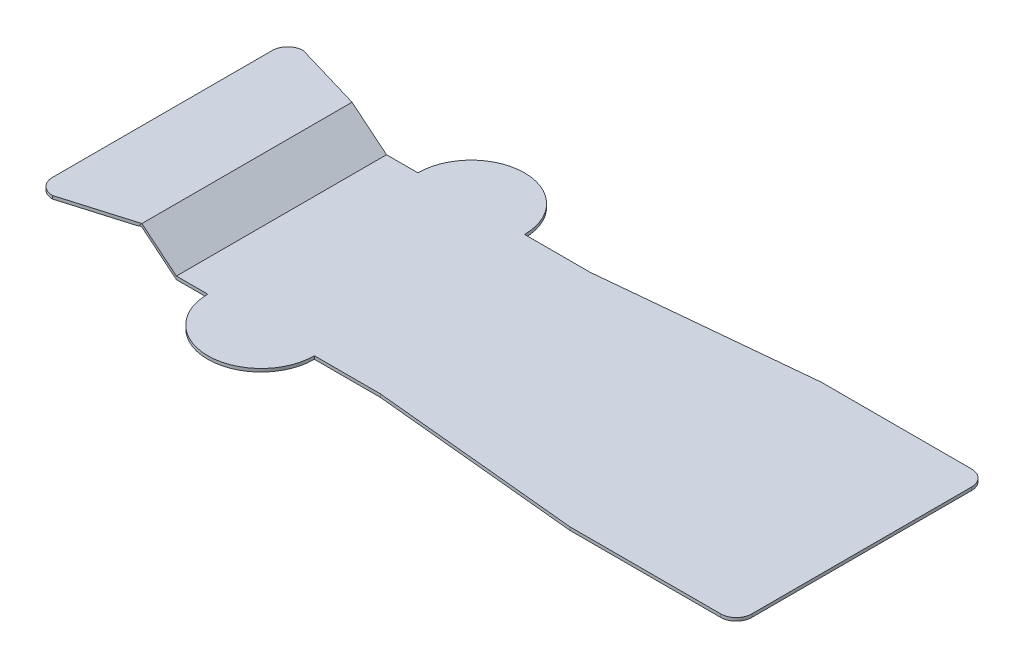
ISO-10303-21;
HEADER;
FILE_DESCRIPTION(('STEP AP214'),'2;1');
FILE_NAME('part.step','',(''),(''),'','','');
FILE_SCHEMA(('AUTOMOTIVE_DESIGN { 1 0 10303 214 1 1 1 1 }'));
ENDSEC;
DATA;
#1=APPLICATION_CONTEXT('core data for automotive mechanical design processes');
#2=APPLICATION_PROTOCOL_DEFINITION('international standard','automotive_design',2000,#1);
#3=PRODUCT_CONTEXT('',#1,'mechanical');
#4=PRODUCT('Part','Part','',(#3));
#5=PRODUCT_RELATED_PRODUCT_CATEGORY('part','',(#4));
#6=PRODUCT_DEFINITION_FORMATION('','',#4);
#7=PRODUCT_DEFINITION_CONTEXT('part definition',#1,'design');
#8=PRODUCT_DEFINITION('design','',#6,#7);
#9=PRODUCT_DEFINITION_SHAPE('','',#8);
#10=(LENGTH_UNIT() NAMED_UNIT(*) SI_UNIT(.MILLI.,.METRE.));
#11=(NAMED_UNIT(*) PLANE_ANGLE_UNIT() SI_UNIT($,.RADIAN.));
#12=(NAMED_UNIT(*) SI_UNIT($,.STERADIAN.) SOLID_ANGLE_UNIT());
#13=UNCERTAINTY_MEASURE_WITH_UNIT(LENGTH_MEASURE(1.E-05),#10,'distance_accuracy_value','');
#14=(GEOMETRIC_REPRESENTATION_CONTEXT(3) GLOBAL_UNCERTAINTY_ASSIGNED_CONTEXT((#13)) GLOBAL_UNIT_ASSIGNED_CONTEXT((#10,
#11,#12)) REPRESENTATION_CONTEXT('',''));
#15=CARTESIAN_POINT('',(0.,0.,0.));
#16=DIRECTION('',(0.,0.,1.));
#17=DIRECTION('',(1.,0.,0.));
#18=AXIS2_PLACEMENT_3D('',#15,#16,#17);
#19=CARTESIAN_POINT('',(-100.227722772277,-9.22277227722782,33.5));
#20=DIRECTION('',(0.,0.,-1.));
#21=DIRECTION('',(-1.,0.,0.));
#22=AXIS2_PLACEMENT_3D('',#19,#20,#21);
#23=PLANE('',#22);
#24=DIRECTION('',(-1.,0.,0.));
#25=VECTOR('',#24,1.);
#26=CARTESIAN_POINT('',(-73.5000000000001,0.,33.4999999999999));
#27=LINE('',#26,#25);
#28=CARTESIAN_POINT('',(-63.5000000000001,0.,33.4999999999999));
#29=VERTEX_POINT('',#28);
#30=CARTESIAN_POINT('',(-73.5000000000001,0.,33.4999999999999));
#31=VERTEX_POINT('',#30);
#32=EDGE_CURVE('E66',#29,#31,#27,.T.);
#33=ORIENTED_EDGE('',*,*,#32,.F.);
#34=DIRECTION('',(0.,1.,0.));
#35=VECTOR('',#34,1.);
#36=CARTESIAN_POINT('',(-63.5000000000001,0.,33.4999999999999));
#37=LINE('',#36,#35);
#38=CARTESIAN_POINT('',(-63.5000000000001,0.999999999999979,33.4999999999999));
#39=VERTEX_POINT('',#38);
#40=EDGE_CURVE('E204',#29,#39,#37,.T.);
#41=ORIENTED_EDGE('',*,*,#40,.T.);
#42=DIRECTION('',(-1.,0.,0.));
#43=VECTOR('',#42,1.);
#44=CARTESIAN_POINT('',(-73.5000000000001,0.999999999999977,33.4999999999999));
#45=LINE('',#44,#43);
#46=CARTESIAN_POINT('',(-73.5000000000001,0.999999999999723,33.4999999999999));
#47=VERTEX_POINT('',#46);
#48=EDGE_CURVE('E194',#39,#47,#45,.T.);
#49=ORIENTED_EDGE('',*,*,#48,.T.);
#50=DIRECTION('',(-0.77395729920332,0.633237790257263,0.));
#51=VECTOR('',#50,1.);
#52=CARTESIAN_POINT('',(-84.5,9.99999999999992,33.5));
#53=LINE('',#52,#51);
#54=CARTESIAN_POINT('',(-84.5,10.,33.5));
#55=VERTEX_POINT('',#54);
#56=EDGE_CURVE('E284',#47,#55,#53,.T.);
#57=ORIENTED_EDGE('',*,*,#56,.T.);
#58=DIRECTION('',(0.633237790257263,0.773957299203321,0.));
#59=VECTOR('',#58,1.);
#60=CARTESIAN_POINT('',(-100.227722772277,-9.22277227722782,33.5));
#61=LINE('',#60,#59);
#62=CARTESIAN_POINT('',(-85.3181818181817,9.,33.5));
#63=VERTEX_POINT('',#62);
#64=EDGE_CURVE('E276',#63,#55,#61,.T.);
#65=ORIENTED_EDGE('',*,*,#64,.F.);
#66=DIRECTION('',(1.,0.,0.));
#67=VECTOR('',#66,1.);
#68=CARTESIAN_POINT('',(-111.5,9.,33.5000000000001));
#69=LINE('',#68,#67);
#70=CARTESIAN_POINT('',(-84.5,9.,33.5));
#71=VERTEX_POINT('',#70);
#72=EDGE_CURVE('E292',#63,#71,#69,.T.);
#73=ORIENTED_EDGE('',*,*,#72,.T.);
#74=DIRECTION('',(0.77395729920332,-0.633237790257263,0.));
#75=VECTOR('',#74,1.);
#76=CARTESIAN_POINT('',(-84.4999999999998,8.99999999999982,33.5));
#77=LINE('',#76,#75);
#78=EDGE_CURVE('E287',#71,#31,#77,.T.);
#79=ORIENTED_EDGE('',*,*,#78,.T.);
#80=EDGE_LOOP('',(#33,#41,#49,#57,#65,#73,#79));
#81=FACE_BOUND('',#80,.T.);
#82=ADVANCED_FACE('F43',(#81),#23,.F.);
#83=CARTESIAN_POINT('',(-100.227722772277,-9.22277227722775,-33.5));
#84=DIRECTION('',(0.,0.,1.));
#85=DIRECTION('',(1.,0.,0.));
#86=AXIS2_PLACEMENT_3D('',#83,#84,#85);
#87=PLANE('',#86);
#88=DIRECTION('',(0.,1.,0.));
#89=VECTOR('',#88,1.);
#90=CARTESIAN_POINT('',(-29.5000000000001,0.,-33.5));
#91=LINE('',#90,#89);
#92=CARTESIAN_POINT('',(-29.5000000000001,0.,-33.5));
#93=VERTEX_POINT('',#92);
#94=CARTESIAN_POINT('',(-29.5000000000001,0.999999999999983,-33.5));
#95=VERTEX_POINT('',#94);
#96=EDGE_CURVE('E223',#93,#95,#91,.T.);
#97=ORIENTED_EDGE('',*,*,#96,.T.);
#98=DIRECTION('',(1.,0.,0.));
#99=VECTOR('',#98,1.);
#100=CARTESIAN_POINT('',(-73.5000000000001,0.999999999999977,-33.5));
#101=LINE('',#100,#99);
#102=CARTESIAN_POINT('',(-8.49999999999995,0.999999999999985,-33.4999999999999));
#103=VERTEX_POINT('',#102);
#104=EDGE_CURVE('E273',#95,#103,#101,.T.);
#105=ORIENTED_EDGE('',*,*,#104,.T.);
#106=DIRECTION('',(0.,1.,0.));
#107=VECTOR('',#106,1.);
#108=CARTESIAN_POINT('',(-8.49999999999995,0.,-33.4999999999999));
#109=LINE('',#108,#107);
#110=CARTESIAN_POINT('',(-8.49999999999995,0.,-33.4999999999999));
#111=VERTEX_POINT('',#110);
#112=EDGE_CURVE('E269',#111,#103,#109,.T.);
#113=ORIENTED_EDGE('',*,*,#112,.F.);
#114=DIRECTION('',(1.,0.,0.));
#115=VECTOR('',#114,1.);
#116=CARTESIAN_POINT('',(-73.5000000000001,0.,-33.5));
#117=LINE('',#116,#115);
#118=EDGE_CURVE('E270',#93,#111,#117,.T.);
#119=ORIENTED_EDGE('',*,*,#118,.F.);
#120=EDGE_LOOP('',(#97,#105,#113,#119));
#121=FACE_BOUND('',#120,.T.);
#122=ADVANCED_FACE('F418',(#121),#87,.F.);
#123=DIRECTION('',(0.,1.,0.));
#124=VECTOR('',#123,1.);
#125=CARTESIAN_POINT('',(-63.5000000000001,0.,-33.5));
#126=LINE('',#125,#124);
#127=CARTESIAN_POINT('',(-63.5000000000001,0.,-33.5));
#128=VERTEX_POINT('',#127);
#129=CARTESIAN_POINT('',(-63.5000000000001,0.999999999999979,-33.5));
#130=VERTEX_POINT('',#129);
#131=EDGE_CURVE('E220',#128,#130,#126,.T.);
#132=ORIENTED_EDGE('',*,*,#131,.F.);
#133=CARTESIAN_POINT('',(-73.5000000000002,0.,-33.5));
#134=VERTEX_POINT('',#133);
#135=EDGE_CURVE('E266',#134,#128,#117,.T.);
#136=ORIENTED_EDGE('',*,*,#135,.F.);
#137=DIRECTION('',(-0.77395729920332,0.633237790257263,0.));
#138=VECTOR('',#137,1.);
#139=CARTESIAN_POINT('',(-84.5,9.,-33.5));
#140=LINE('',#139,#138);
#141=CARTESIAN_POINT('',(-84.5,9.,-33.5));
#142=VERTEX_POINT('',#141);
#143=EDGE_CURVE('E298',#134,#142,#140,.T.);
#144=ORIENTED_EDGE('',*,*,#143,.T.);
#145=DIRECTION('',(-1.,0.,0.));
#146=VECTOR('',#145,1.);
#147=CARTESIAN_POINT('',(-111.5,9.,-33.5));
#148=LINE('',#147,#146);
#149=CARTESIAN_POINT('',(-85.3181818181819,9.,-33.5));
#150=VERTEX_POINT('',#149);
#151=EDGE_CURVE('E300',#142,#150,#148,.T.);
#152=ORIENTED_EDGE('',*,*,#151,.T.);
#153=DIRECTION('',(0.633237790257263,0.773957299203321,0.));
#154=VECTOR('',#153,1.);
#155=CARTESIAN_POINT('',(-100.227722772277,-9.22277227722775,-33.5));
#156=LINE('',#155,#154);
#157=CARTESIAN_POINT('',(-84.5000000000001,9.99999999999999,-33.5));
#158=VERTEX_POINT('',#157);
#159=EDGE_CURVE('E283',#150,#158,#156,.T.);
#160=ORIENTED_EDGE('',*,*,#159,.T.);
#161=DIRECTION('',(0.773957299203321,-0.633237790257263,0.));
#162=VECTOR('',#161,1.);
#163=CARTESIAN_POINT('',(-84.5000000000001,9.99999999999999,-33.5));
#164=LINE('',#163,#162);
#165=CARTESIAN_POINT('',(-73.5000000000001,0.999999999999977,-33.5));
#166=VERTEX_POINT('',#165);
#167=EDGE_CURVE('E280',#158,#166,#164,.T.);
#168=ORIENTED_EDGE('',*,*,#167,.T.);
#169=EDGE_CURVE('E271',#166,#130,#101,.T.);
#170=ORIENTED_EDGE('',*,*,#169,.T.);
#171=EDGE_LOOP('',(#132,#136,#144,#152,#160,#168,#170));
#172=FACE_BOUND('',#171,.T.);
#173=ADVANCED_FACE('F396',(#172),#87,.F.);
#174=CARTESIAN_POINT('',(-111.5,10.,40.));
#175=DIRECTION('',(0.,0.,-1.));
#176=DIRECTION('',(-1.,0.,0.));
#177=AXIS2_PLACEMENT_3D('',#174,#175,#176);
#178=PLANE('',#177);
#179=DIRECTION('',(0.,1.,0.));
#180=VECTOR('',#179,1.);
#181=CARTESIAN_POINT('',(106.53,0.,40.));
#182=LINE('',#181,#180);
#183=CARTESIAN_POINT('',(106.53,0.,40.));
#184=VERTEX_POINT('',#183);
#185=CARTESIAN_POINT('',(106.53,0.999999999999999,40.));
#186=VERTEX_POINT('',#185);
#187=EDGE_CURVE('E235',#184,#186,#182,.T.);
#188=ORIENTED_EDGE('',*,*,#187,.T.);
#189=DIRECTION('',(-1.,0.,0.));
#190=VECTOR('',#189,1.);
#191=CARTESIAN_POINT('',(-73.5,0.999999999999977,40.));
#192=LINE('',#191,#190);
#193=CARTESIAN_POINT('',(58.5,0.999999999999994,40.));
#194=VERTEX_POINT('',#193);
#195=EDGE_CURVE('E325',#186,#194,#192,.T.);
#196=ORIENTED_EDGE('',*,*,#195,.T.);
#197=DIRECTION('',(0.,1.,0.));
#198=VECTOR('',#197,1.);
#199=CARTESIAN_POINT('',(58.5,0.,40.));
#200=LINE('',#199,#198);
#201=CARTESIAN_POINT('',(58.5,0.,40.));
#202=VERTEX_POINT('',#201);
#203=EDGE_CURVE('E251',#202,#194,#200,.T.);
#204=ORIENTED_EDGE('',*,*,#203,.F.);
#205=DIRECTION('',(1.,0.,0.));
#206=VECTOR('',#205,1.);
#207=CARTESIAN_POINT('',(-111.5,0.,40.));
#208=LINE('',#207,#206);
#209=EDGE_CURVE('E356',#202,#184,#208,.T.);
#210=ORIENTED_EDGE('',*,*,#209,.T.);
#211=EDGE_LOOP('',(#188,#196,#204,#210));
#212=FACE_BOUND('',#211,.T.);
#213=ADVANCED_FACE('F486',(#212),#178,.F.);
#214=CARTESIAN_POINT('',(0.,0.,0.));
#215=DIRECTION('',(0.,1.,0.));
#216=DIRECTION('',(0.,0.,1.));
#217=AXIS2_PLACEMENT_3D('',#214,#215,#216);
#218=PLANE('',#217);
#219=CARTESIAN_POINT('',(106.53,0.,-35.03));
#220=DIRECTION('',(0.,1.,0.));
#221=DIRECTION('',(-1.,0.,0.));
#222=AXIS2_PLACEMENT_3D('',#219,#220,#221);
#223=CIRCLE('',#222,4.97);
#224=CARTESIAN_POINT('',(111.5,0.,-35.03));
#225=VERTEX_POINT('',#224);
#226=CARTESIAN_POINT('',(106.53,0.,-40.));
#227=VERTEX_POINT('',#226);
#228=EDGE_CURVE('E229',#225,#227,#223,.T.);
#229=ORIENTED_EDGE('',*,*,#228,.F.);
#230=DIRECTION('',(0.,0.,-1.));
#231=VECTOR('',#230,1.);
#232=CARTESIAN_POINT('',(111.5,0.,-40.));
#233=LINE('',#232,#231);
#234=CARTESIAN_POINT('',(111.5,0.,35.03));
#235=VERTEX_POINT('',#234);
#236=EDGE_CURVE('E340',#235,#225,#233,.T.);
#237=ORIENTED_EDGE('',*,*,#236,.F.);
#238=CARTESIAN_POINT('',(106.53,0.,35.03));
#239=DIRECTION('',(0.,1.,0.));
#240=DIRECTION('',(-1.,0.,0.));
#241=AXIS2_PLACEMENT_3D('',#238,#239,#240);
#242=CIRCLE('',#241,4.97);
#243=EDGE_CURVE('E241',#235,#184,#242,.F.);
#244=ORIENTED_EDGE('',*,*,#243,.T.);
#245=ORIENTED_EDGE('',*,*,#209,.F.);
#246=DIRECTION('',(0.995327012628998,0.,0.0965615758520676));
#247=VECTOR('',#246,1.);
#248=CARTESIAN_POINT('',(-3.29895172413795,0.,34.0045793103448));
#249=LINE('',#248,#247);
#250=CARTESIAN_POINT('',(-8.49999999999995,0.,33.4999999999999));
#251=VERTEX_POINT('',#250);
#252=EDGE_CURVE('E249',#251,#202,#249,.T.);
#253=ORIENTED_EDGE('',*,*,#252,.F.);
#254=CARTESIAN_POINT('',(-29.5000000000001,0.,33.4999999999999));
#255=VERTEX_POINT('',#254);
#256=EDGE_CURVE('E202',#251,#255,#27,.T.);
#257=ORIENTED_EDGE('',*,*,#256,.T.);
#258=CARTESIAN_POINT('',(-46.5000000000001,0.,33.5));
#259=DIRECTION('',(0.,1.,0.));
#260=DIRECTION('',(-1.,0.,0.));
#261=AXIS2_PLACEMENT_3D('',#258,#259,#260);
#262=CIRCLE('',#261,17.);
#263=EDGE_CURVE('E209',#29,#255,#262,.T.);
#264=ORIENTED_EDGE('',*,*,#263,.F.);
#265=ORIENTED_EDGE('',*,*,#32,.T.);
#266=DIRECTION('',(0.,0.,1.));
#267=VECTOR('',#266,1.);
#268=CARTESIAN_POINT('',(-73.5,0.,-40.));
#269=LINE('',#268,#267);
#270=EDGE_CURVE('E345',#134,#31,#269,.T.);
#271=ORIENTED_EDGE('',*,*,#270,.F.);
#272=ORIENTED_EDGE('',*,*,#135,.T.);
#273=CARTESIAN_POINT('',(-46.5000000000001,0.,-33.5));
#274=DIRECTION('',(0.,1.,0.));
#275=DIRECTION('',(-1.,0.,0.));
#276=AXIS2_PLACEMENT_3D('',#273,#274,#275);
#277=CIRCLE('',#276,17.);
#278=EDGE_CURVE('E217',#128,#93,#277,.F.);
#279=ORIENTED_EDGE('',*,*,#278,.T.);
#280=ORIENTED_EDGE('',*,*,#118,.T.);
#281=DIRECTION('',(0.995327012628998,0.,-0.0965615758520672));
#282=VECTOR('',#281,1.);
#283=CARTESIAN_POINT('',(-3.29895172413794,0.,-34.0045793103448));
#284=LINE('',#283,#282);
#285=CARTESIAN_POINT('',(58.5,0.,-40.));
#286=VERTEX_POINT('',#285);
#287=EDGE_CURVE('E259',#111,#286,#284,.T.);
#288=ORIENTED_EDGE('',*,*,#287,.T.);
#289=DIRECTION('',(-1.,0.,0.));
#290=VECTOR('',#289,1.);
#291=CARTESIAN_POINT('',(-111.5,0.,-40.));
#292=LINE('',#291,#290);
#293=EDGE_CURVE('E359',#227,#286,#292,.T.);
#294=ORIENTED_EDGE('',*,*,#293,.F.);
#295=EDGE_LOOP('',(#229,#237,#244,#245,#253,#257,#264,#265,#271,#272,#279,#280,#288,#294));
#296=FACE_BOUND('',#295,.T.);
#297=ADVANCED_FACE('F490',(#296),#218,.F.);
#298=CARTESIAN_POINT('',(-73.5,0.999999999999977,-40.));
#299=DIRECTION('',(0.,1.,0.));
#300=DIRECTION('',(-1.,0.,0.));
#301=AXIS2_PLACEMENT_3D('',#298,#299,#300);
#302=PLANE('',#301);
#303=DIRECTION('',(0.,0.,1.));
#304=VECTOR('',#303,1.);
#305=CARTESIAN_POINT('',(111.5,1.,-40.));
#306=LINE('',#305,#304);
#307=CARTESIAN_POINT('',(111.5,1.,-35.03));
#308=VERTEX_POINT('',#307);
#309=CARTESIAN_POINT('',(111.5,1.,35.03));
#310=VERTEX_POINT('',#309);
#311=EDGE_CURVE('E342',#308,#310,#306,.T.);
#312=ORIENTED_EDGE('',*,*,#311,.F.);
#313=CARTESIAN_POINT('',(106.53,0.999999999999999,-35.03));
#314=DIRECTION('',(0.,1.,0.));
#315=DIRECTION('',(-1.,0.,0.));
#316=AXIS2_PLACEMENT_3D('',#313,#314,#315);
#317=CIRCLE('',#316,4.97);
#318=CARTESIAN_POINT('',(106.53,0.999999999999999,-40.));
#319=VERTEX_POINT('',#318);
#320=EDGE_CURVE('E232',#308,#319,#317,.T.);
#321=ORIENTED_EDGE('',*,*,#320,.T.);
#322=DIRECTION('',(-1.,0.,0.));
#323=VECTOR('',#322,1.);
#324=CARTESIAN_POINT('',(-73.5,0.999999999999977,-40.));
#325=LINE('',#324,#323);
#326=CARTESIAN_POINT('',(58.5,0.999999999999994,-40.));
#327=VERTEX_POINT('',#326);
#328=EDGE_CURVE('E333',#319,#327,#325,.T.);
#329=ORIENTED_EDGE('',*,*,#328,.T.);
#330=DIRECTION('',(0.995327012628998,0.,-0.0965615758520672));
#331=VECTOR('',#330,1.);
#332=CARTESIAN_POINT('',(-3.29895172413794,0.999999999999986,-34.0045793103448));
#333=LINE('',#332,#331);
#334=EDGE_CURVE('E238',#103,#327,#333,.T.);
#335=ORIENTED_EDGE('',*,*,#334,.F.);
#336=ORIENTED_EDGE('',*,*,#104,.F.);
#337=CARTESIAN_POINT('',(-46.5000000000001,0.999999999999981,-33.5));
#338=DIRECTION('',(0.,1.,0.));
#339=DIRECTION('',(-1.,0.,0.));
#340=AXIS2_PLACEMENT_3D('',#337,#338,#339);
#341=CIRCLE('',#340,17.);
#342=EDGE_CURVE('E215',#130,#95,#341,.F.);
#343=ORIENTED_EDGE('',*,*,#342,.F.);
#344=ORIENTED_EDGE('',*,*,#169,.F.);
#345=DIRECTION('',(0.,0.,1.));
#346=VECTOR('',#345,1.);
#347=CARTESIAN_POINT('',(-73.5,0.999999999999977,-40.));
#348=LINE('',#347,#346);
#349=EDGE_CURVE('E200',#166,#47,#348,.T.);
#350=ORIENTED_EDGE('',*,*,#349,.T.);
#351=ORIENTED_EDGE('',*,*,#48,.F.);
#352=CARTESIAN_POINT('',(-46.5000000000001,0.999999999999981,33.5));
#353=DIRECTION('',(0.,1.,0.));
#354=DIRECTION('',(-1.,0.,0.));
#355=AXIS2_PLACEMENT_3D('',#352,#353,#354);
#356=CIRCLE('',#355,17.);
#357=CARTESIAN_POINT('',(-29.5000000000001,0.999999999999983,33.4999999999999));
#358=VERTEX_POINT('',#357);
#359=EDGE_CURVE('E198',#39,#358,#356,.T.);
#360=ORIENTED_EDGE('',*,*,#359,.T.);
#361=CARTESIAN_POINT('',(-8.49999999999995,0.999999999999985,33.4999999999999));
#362=VERTEX_POINT('',#361);
#363=EDGE_CURVE('E58',#362,#358,#45,.T.);
#364=ORIENTED_EDGE('',*,*,#363,.F.);
#365=DIRECTION('',(0.995327012628998,0.,0.0965615758520676));
#366=VECTOR('',#365,1.);
#367=CARTESIAN_POINT('',(-3.29895172413795,0.999999999999986,34.0045793103448));
#368=LINE('',#367,#366);
#369=EDGE_CURVE('E252',#362,#194,#368,.T.);
#370=ORIENTED_EDGE('',*,*,#369,.T.);
#371=ORIENTED_EDGE('',*,*,#195,.F.);
#372=CARTESIAN_POINT('',(106.53,0.999999999999999,35.03));
#373=DIRECTION('',(0.,1.,0.));
#374=DIRECTION('',(-1.,0.,0.));
#375=AXIS2_PLACEMENT_3D('',#372,#373,#374);
#376=CIRCLE('',#375,4.97);
#377=EDGE_CURVE('E226',#310,#186,#376,.F.);
#378=ORIENTED_EDGE('',*,*,#377,.F.);
#379=EDGE_LOOP('',(#312,#321,#329,#335,#336,#343,#344,#350,#351,#360,#364,#370,#371,#378));
#380=FACE_BOUND('',#379,.T.);
#381=ADVANCED_FACE('F196',(#380),#302,.T.);
#382=CARTESIAN_POINT('',(-111.5,10.,-40.));
#383=DIRECTION('',(0.,0.,1.));
#384=DIRECTION('',(1.,0.,0.));
#385=AXIS2_PLACEMENT_3D('',#382,#383,#384);
#386=PLANE('',#385);
#387=DIRECTION('',(0.,1.,0.));
#388=VECTOR('',#387,1.);
#389=CARTESIAN_POINT('',(106.53,0.,-40.));
#390=LINE('',#389,#388);
#391=EDGE_CURVE('E236',#227,#319,#390,.T.);
#392=ORIENTED_EDGE('',*,*,#391,.F.);
#393=ORIENTED_EDGE('',*,*,#293,.T.);
#394=DIRECTION('',(0.,1.,0.));
#395=VECTOR('',#394,1.);
#396=CARTESIAN_POINT('',(58.5,0.,-40.));
#397=LINE('',#396,#395);
#398=EDGE_CURVE('E255',#286,#327,#397,.T.);
#399=ORIENTED_EDGE('',*,*,#398,.T.);
#400=ORIENTED_EDGE('',*,*,#328,.F.);
#401=EDGE_LOOP('',(#392,#393,#399,#400));
#402=FACE_BOUND('',#401,.T.);
#403=ADVANCED_FACE('F497',(#402),#386,.F.);
#404=CARTESIAN_POINT('',(0.,10.,0.));
#405=DIRECTION('',(0.,1.,0.));
#406=DIRECTION('',(0.,0.,1.));
#407=AXIS2_PLACEMENT_3D('',#404,#405,#406);
#408=PLANE('',#407);
#409=DIRECTION('',(0.,0.,1.));
#410=VECTOR('',#409,1.);
#411=CARTESIAN_POINT('',(-84.5,10.,-40.));
#412=LINE('',#411,#410);
#413=EDGE_CURVE('E337',#158,#55,#412,.T.);
#414=ORIENTED_EDGE('',*,*,#413,.F.);
#415=DIRECTION('',(-0.959120090127778,0.,-0.282999386418564));
#416=VECTOR('',#415,1.);
#417=CARTESIAN_POINT('',(2.32542714549147,10.,-7.88116158693922));
#418=LINE('',#417,#416);
#419=CARTESIAN_POINT('',(-106.529307783056,10.,-40.));
#420=VERTEX_POINT('',#419);
#421=EDGE_CURVE('E307',#158,#420,#418,.T.);
#422=ORIENTED_EDGE('',*,*,#421,.T.);
#423=CARTESIAN_POINT('',(-106.529307783056,10.,-35.0293077830562));
#424=DIRECTION('',(0.,1.,0.));
#425=DIRECTION('',(0.,0.,1.));
#426=AXIS2_PLACEMENT_3D('',#423,#424,#425);
#427=CIRCLE('',#426,4.97069221694385);
#428=CARTESIAN_POINT('',(-111.5,10.,-35.0293077830562));
#429=VERTEX_POINT('',#428);
#430=EDGE_CURVE('E318',#420,#429,#427,.T.);
#431=ORIENTED_EDGE('',*,*,#430,.T.);
#432=DIRECTION('',(0.,0.,1.));
#433=VECTOR('',#432,1.);
#434=CARTESIAN_POINT('',(-111.5,10.,-40.));
#435=LINE('',#434,#433);
#436=CARTESIAN_POINT('',(-111.5,10.,35.0293077830561));
#437=VERTEX_POINT('',#436);
#438=EDGE_CURVE('E353',#429,#437,#435,.T.);
#439=ORIENTED_EDGE('',*,*,#438,.T.);
#440=CARTESIAN_POINT('',(-106.529307783056,10.,35.0293077830562));
#441=DIRECTION('',(0.,1.,0.));
#442=DIRECTION('',(0.,0.,1.));
#443=AXIS2_PLACEMENT_3D('',#440,#441,#442);
#444=CIRCLE('',#443,4.97069221694385);
#445=CARTESIAN_POINT('',(-106.529307783056,10.,40.));
#446=VERTEX_POINT('',#445);
#447=EDGE_CURVE('E317',#446,#437,#444,.F.);
#448=ORIENTED_EDGE('',*,*,#447,.F.);
#449=DIRECTION('',(0.959120090127778,0.,-0.282999386418562));
#450=VECTOR('',#449,1.);
#451=CARTESIAN_POINT('',(2.32542714549151,10.,7.88116158693943));
#452=LINE('',#451,#450);
#453=EDGE_CURVE('E306',#446,#55,#452,.T.);
#454=ORIENTED_EDGE('',*,*,#453,.T.);
#455=EDGE_LOOP('',(#414,#422,#431,#439,#448,#454));
#456=FACE_BOUND('',#455,.T.);
#457=ADVANCED_FACE('F384',(#456),#408,.T.);
#458=CARTESIAN_POINT('',(-111.5,9.,-40.));
#459=DIRECTION('',(0.,-1.,0.));
#460=DIRECTION('',(0.,0.,-1.));
#461=AXIS2_PLACEMENT_3D('',#458,#459,#460);
#462=PLANE('',#461);
#463=DIRECTION('',(0.,0.,-1.));
#464=VECTOR('',#463,1.);
#465=CARTESIAN_POINT('',(-85.3181818181819,9.,-40.));
#466=LINE('',#465,#464);
#467=CARTESIAN_POINT('',(-85.3181818181819,9.,-33.7414139323194));
#468=VERTEX_POINT('',#467);
#469=EDGE_CURVE('E304',#150,#468,#466,.T.);
#470=ORIENTED_EDGE('',*,*,#469,.F.);
#471=ORIENTED_EDGE('',*,*,#151,.F.);
#472=DIRECTION('',(0.,0.,1.));
#473=VECTOR('',#472,1.);
#474=CARTESIAN_POINT('',(-84.5,9.,-40.));
#475=LINE('',#474,#473);
#476=EDGE_CURVE('E348',#142,#71,#475,.T.);
#477=ORIENTED_EDGE('',*,*,#476,.T.);
#478=ORIENTED_EDGE('',*,*,#72,.F.);
#479=DIRECTION('',(0.,0.,-1.));
#480=VECTOR('',#479,1.);
#481=CARTESIAN_POINT('',(-85.3181818181822,9.,-40.0000000000002));
#482=LINE('',#481,#480);
#483=CARTESIAN_POINT('',(-85.3181818181817,9.,33.7414139323194));
#484=VERTEX_POINT('',#483);
#485=EDGE_CURVE('E296',#484,#63,#482,.T.);
#486=ORIENTED_EDGE('',*,*,#485,.F.);
#487=DIRECTION('',(-0.959120090127778,0.,0.282999386418562));
#488=VECTOR('',#487,1.);
#489=CARTESIAN_POINT('',(-89.3874721966624,9.,34.9421047447864));
#490=LINE('',#489,#488);
#491=CARTESIAN_POINT('',(-106.529307783056,9.,40.));
#492=VERTEX_POINT('',#491);
#493=EDGE_CURVE('E315',#484,#492,#490,.T.);
#494=ORIENTED_EDGE('',*,*,#493,.T.);
#495=CARTESIAN_POINT('',(-106.529307783056,9.,35.0293077830562));
#496=DIRECTION('',(0.,-1.,0.));
#497=DIRECTION('',(0.,0.,-1.));
#498=AXIS2_PLACEMENT_3D('',#495,#496,#497);
#499=CIRCLE('',#498,4.97069221694385);
#500=CARTESIAN_POINT('',(-111.5,9.,35.0293077830562));
#501=VERTEX_POINT('',#500);
#502=EDGE_CURVE('E51',#501,#492,#499,.F.);
#503=ORIENTED_EDGE('',*,*,#502,.F.);
#504=DIRECTION('',(0.,0.,1.));
#505=VECTOR('',#504,1.);
#506=CARTESIAN_POINT('',(-111.5,9.,-40.));
#507=LINE('',#506,#505);
#508=CARTESIAN_POINT('',(-111.5,9.,-35.0293077830562));
#509=VERTEX_POINT('',#508);
#510=EDGE_CURVE('E335',#509,#501,#507,.T.);
#511=ORIENTED_EDGE('',*,*,#510,.F.);
#512=CARTESIAN_POINT('',(-106.529307783056,9.,-35.0293077830562));
#513=DIRECTION('',(0.,-1.,0.));
#514=DIRECTION('',(0.,0.,-1.));
#515=AXIS2_PLACEMENT_3D('',#512,#513,#514);
#516=CIRCLE('',#515,4.97069221694385);
#517=CARTESIAN_POINT('',(-106.529307783056,9.,-40.));
#518=VERTEX_POINT('',#517);
#519=EDGE_CURVE('E12',#509,#518,#516,.T.);
#520=ORIENTED_EDGE('',*,*,#519,.T.);
#521=DIRECTION('',(0.959120090127778,0.,0.282999386418564));
#522=VECTOR('',#521,1.);
#523=CARTESIAN_POINT('',(-111.101903957293,9.,-41.3491969618491));
#524=LINE('',#523,#522);
#525=EDGE_CURVE('E310',#518,#468,#524,.T.);
#526=ORIENTED_EDGE('',*,*,#525,.T.);
#527=EDGE_LOOP('',(#470,#471,#477,#478,#486,#494,#503,#511,#520,#526));
#528=FACE_BOUND('',#527,.T.);
#529=ADVANCED_FACE('F371',(#528),#462,.T.);
#530=CARTESIAN_POINT('',(-111.5,10.,-40.));
#531=DIRECTION('',(1.,0.,0.));
#532=DIRECTION('',(0.,0.,-1.));
#533=AXIS2_PLACEMENT_3D('',#530,#531,#532);
#534=PLANE('',#533);
#535=DIRECTION('',(0.,1.,0.));
#536=VECTOR('',#535,1.);
#537=CARTESIAN_POINT('',(-111.5,0.,-35.0293077830562));
#538=LINE('',#537,#536);
#539=EDGE_CURVE('E323',#509,#429,#538,.T.);
#540=ORIENTED_EDGE('',*,*,#539,.F.);
#541=ORIENTED_EDGE('',*,*,#510,.T.);
#542=DIRECTION('',(0.,1.,0.));
#543=VECTOR('',#542,1.);
#544=CARTESIAN_POINT('',(-111.5,0.,35.0293077830561));
#545=LINE('',#544,#543);
#546=EDGE_CURVE('E322',#501,#437,#545,.T.);
#547=ORIENTED_EDGE('',*,*,#546,.T.);
#548=ORIENTED_EDGE('',*,*,#438,.F.);
#549=EDGE_LOOP('',(#540,#541,#547,#548));
#550=FACE_BOUND('',#549,.T.);
#551=ADVANCED_FACE('F376',(#550),#534,.F.);
#552=CARTESIAN_POINT('',(111.5,10.,-40.));
#553=DIRECTION('',(-1.,0.,0.));
#554=DIRECTION('',(0.,0.,1.));
#555=AXIS2_PLACEMENT_3D('',#552,#553,#554);
#556=PLANE('',#555);
#557=ORIENTED_EDGE('',*,*,#236,.T.);
#558=DIRECTION('',(0.,1.,0.));
#559=VECTOR('',#558,1.);
#560=CARTESIAN_POINT('',(111.5,0.,-35.03));
#561=LINE('',#560,#559);
#562=EDGE_CURVE('E231',#225,#308,#561,.T.);
#563=ORIENTED_EDGE('',*,*,#562,.T.);
#564=ORIENTED_EDGE('',*,*,#311,.T.);
#565=DIRECTION('',(0.,1.,0.));
#566=VECTOR('',#565,1.);
#567=CARTESIAN_POINT('',(111.5,0.,35.03));
#568=LINE('',#567,#566);
#569=EDGE_CURVE('E244',#235,#310,#568,.T.);
#570=ORIENTED_EDGE('',*,*,#569,.F.);
#571=EDGE_LOOP('',(#557,#563,#564,#570));
#572=FACE_BOUND('',#571,.T.);
#573=ADVANCED_FACE('F45',(#572),#556,.F.);
#574=CARTESIAN_POINT('',(-84.5,9.,-40.));
#575=DIRECTION('',(-0.633237790257263,-0.77395729920332,0.));
#576=DIRECTION('',(0.77395729920332,-0.633237790257263,0.));
#577=AXIS2_PLACEMENT_3D('',#574,#575,#576);
#578=PLANE('',#577);
#579=ORIENTED_EDGE('',*,*,#270,.T.);
#580=ORIENTED_EDGE('',*,*,#78,.F.);
#581=ORIENTED_EDGE('',*,*,#476,.F.);
#582=ORIENTED_EDGE('',*,*,#143,.F.);
#583=EDGE_LOOP('',(#579,#580,#581,#582));
#584=FACE_BOUND('',#583,.T.);
#585=ADVANCED_FACE('F505',(#584),#578,.T.);
#586=CARTESIAN_POINT('',(-84.5,10.,-40.));
#587=DIRECTION('',(0.633237790257263,0.773957299203321,0.));
#588=DIRECTION('',(-0.773957299203321,0.633237790257263,0.));
#589=AXIS2_PLACEMENT_3D('',#586,#587,#588);
#590=PLANE('',#589);
#591=ORIENTED_EDGE('',*,*,#167,.F.);
#592=ORIENTED_EDGE('',*,*,#413,.T.);
#593=ORIENTED_EDGE('',*,*,#56,.F.);
#594=ORIENTED_EDGE('',*,*,#349,.F.);
#595=EDGE_LOOP('',(#591,#592,#593,#594));
#596=FACE_BOUND('',#595,.T.);
#597=ADVANCED_FACE('F398',(#596),#590,.T.);
#598=CARTESIAN_POINT('',(-106.529307783056,0.,35.0293077830562));
#599=DIRECTION('',(0.,1.,0.));
#600=DIRECTION('',(0.,0.,1.));
#601=AXIS2_PLACEMENT_3D('',#598,#599,#600);
#602=CYLINDRICAL_SURFACE('',#601,4.97069221694385);
#603=ORIENTED_EDGE('',*,*,#502,.T.);
#604=DIRECTION('',(0.,1.,0.));
#605=VECTOR('',#604,1.);
#606=CARTESIAN_POINT('',(-106.529307783056,0.,40.));
#607=LINE('',#606,#605);
#608=EDGE_CURVE('E328',#492,#446,#607,.T.);
#609=ORIENTED_EDGE('',*,*,#608,.T.);
#610=ORIENTED_EDGE('',*,*,#447,.T.);
#611=ORIENTED_EDGE('',*,*,#546,.F.);
#612=EDGE_LOOP('',(#603,#609,#610,#611));
#613=FACE_BOUND('',#612,.T.);
#614=ADVANCED_FACE('F365',(#613),#602,.T.);
#615=CARTESIAN_POINT('',(-106.529307783056,0.,-35.0293077830562));
#616=DIRECTION('',(0.,1.,0.));
#617=DIRECTION('',(0.,0.,1.));
#618=AXIS2_PLACEMENT_3D('',#615,#616,#617);
#619=CYLINDRICAL_SURFACE('',#618,4.97069221694385);
#620=ORIENTED_EDGE('',*,*,#539,.T.);
#621=ORIENTED_EDGE('',*,*,#430,.F.);
#622=DIRECTION('',(0.,1.,0.));
#623=VECTOR('',#622,1.);
#624=CARTESIAN_POINT('',(-106.529307783056,0.,-40.));
#625=LINE('',#624,#623);
#626=EDGE_CURVE('E321',#518,#420,#625,.T.);
#627=ORIENTED_EDGE('',*,*,#626,.F.);
#628=ORIENTED_EDGE('',*,*,#519,.F.);
#629=EDGE_LOOP('',(#620,#621,#627,#628));
#630=FACE_BOUND('',#629,.T.);
#631=ADVANCED_FACE('F380',(#630),#619,.T.);
#632=CARTESIAN_POINT('',(2.32542714549147,0.,-7.88116158693922));
#633=DIRECTION('',(0.282999386418564,0.,-0.959120090127778));
#634=DIRECTION('',(-0.959120090127778,0.,-0.282999386418564));
#635=AXIS2_PLACEMENT_3D('',#632,#633,#634);
#636=PLANE('',#635);
#637=DIRECTION('',(0.622465641331859,0.760791339405605,0.183665628920447));
#638=VECTOR('',#637,1.);
#639=CARTESIAN_POINT('',(-52.6650953759241,48.9093278738706,-24.1067461540642));
#640=LINE('',#639,#638);
#641=EDGE_CURVE('E302',#468,#158,#640,.T.);
#642=ORIENTED_EDGE('',*,*,#641,.F.);
#643=ORIENTED_EDGE('',*,*,#525,.F.);
#644=ORIENTED_EDGE('',*,*,#626,.T.);
#645=ORIENTED_EDGE('',*,*,#421,.F.);
#646=EDGE_LOOP('',(#642,#643,#644,#645));
#647=FACE_BOUND('',#646,.T.);
#648=ADVANCED_FACE('F388',(#647),#636,.T.);
#649=CARTESIAN_POINT('',(2.32542714549151,0.,7.88116158693943));
#650=DIRECTION('',(0.282999386418562,0.,0.959120090127778));
#651=DIRECTION('',(0.959120090127778,0.,-0.282999386418562));
#652=AXIS2_PLACEMENT_3D('',#649,#650,#651);
#653=PLANE('',#652);
#654=DIRECTION('',(-0.622465641331859,-0.760791339405605,0.183665628920445));
#655=VECTOR('',#654,1.);
#656=CARTESIAN_POINT('',(-52.6650953759241,48.9093278738705,24.1067461540643));
#657=LINE('',#656,#655);
#658=EDGE_CURVE('E294',#55,#484,#657,.T.);
#659=ORIENTED_EDGE('',*,*,#658,.F.);
#660=ORIENTED_EDGE('',*,*,#453,.F.);
#661=ORIENTED_EDGE('',*,*,#608,.F.);
#662=ORIENTED_EDGE('',*,*,#493,.F.);
#663=EDGE_LOOP('',(#659,#660,#661,#662));
#664=FACE_BOUND('',#663,.T.);
#665=ADVANCED_FACE('F405',(#664),#653,.T.);
#666=ORIENTED_EDGE('',*,*,#363,.T.);
#667=DIRECTION('',(0.,1.,0.));
#668=VECTOR('',#667,1.);
#669=CARTESIAN_POINT('',(-29.5000000000001,0.,33.4999999999999));
#670=LINE('',#669,#668);
#671=EDGE_CURVE('E208',#255,#358,#670,.T.);
#672=ORIENTED_EDGE('',*,*,#671,.F.);
#673=ORIENTED_EDGE('',*,*,#256,.F.);
#674=DIRECTION('',(0.,1.,0.));
#675=VECTOR('',#674,1.);
#676=CARTESIAN_POINT('',(-8.49999999999995,0.,33.4999999999999));
#677=LINE('',#676,#675);
#678=EDGE_CURVE('E258',#251,#362,#677,.T.);
#679=ORIENTED_EDGE('',*,*,#678,.T.);
#680=EDGE_LOOP('',(#666,#672,#673,#679));
#681=FACE_BOUND('',#680,.T.);
#682=ADVANCED_FACE('F407',(#681),#23,.F.);
#683=CARTESIAN_POINT('',(-100.227722772277,-9.22277227722784,40.));
#684=DIRECTION('',(-0.773957299203321,0.633237790257263,0.));
#685=DIRECTION('',(-0.633237790257263,-0.773957299203321,0.));
#686=AXIS2_PLACEMENT_3D('',#683,#684,#685);
#687=PLANE('',#686);
#688=ORIENTED_EDGE('',*,*,#485,.T.);
#689=ORIENTED_EDGE('',*,*,#64,.T.);
#690=ORIENTED_EDGE('',*,*,#658,.T.);
#691=EDGE_LOOP('',(#688,#689,#690));
#692=FACE_BOUND('',#691,.T.);
#693=ADVANCED_FACE('F403',(#692),#687,.F.);
#694=CARTESIAN_POINT('',(-100.227722772277,-9.22277227722775,-40.));
#695=DIRECTION('',(-0.773957299203321,0.633237790257263,0.));
#696=DIRECTION('',(-0.633237790257263,-0.773957299203321,0.));
#697=AXIS2_PLACEMENT_3D('',#694,#695,#696);
#698=PLANE('',#697);
#699=ORIENTED_EDGE('',*,*,#469,.T.);
#700=ORIENTED_EDGE('',*,*,#641,.T.);
#701=ORIENTED_EDGE('',*,*,#159,.F.);
#702=EDGE_LOOP('',(#699,#700,#701));
#703=FACE_BOUND('',#702,.T.);
#704=ADVANCED_FACE('F393',(#703),#698,.F.);
#705=CARTESIAN_POINT('',(-3.29895172413795,0.,34.0045793103448));
#706=DIRECTION('',(-0.0965615758520676,0.,0.995327012628998));
#707=DIRECTION('',(0.995327012628998,0.,0.0965615758520676));
#708=AXIS2_PLACEMENT_3D('',#705,#706,#707);
#709=PLANE('',#708);
#710=ORIENTED_EDGE('',*,*,#369,.F.);
#711=ORIENTED_EDGE('',*,*,#678,.F.);
#712=ORIENTED_EDGE('',*,*,#252,.T.);
#713=ORIENTED_EDGE('',*,*,#203,.T.);
#714=EDGE_LOOP('',(#710,#711,#712,#713));
#715=FACE_BOUND('',#714,.T.);
#716=ADVANCED_FACE('F430',(#715),#709,.T.);
#717=CARTESIAN_POINT('',(-3.29895172413794,0.,-34.0045793103448));
#718=DIRECTION('',(0.0965615758520671,0.,0.995327012628998));
#719=DIRECTION('',(0.995327012628998,0.,-0.0965615758520672));
#720=AXIS2_PLACEMENT_3D('',#717,#718,#719);
#721=PLANE('',#720);
#722=ORIENTED_EDGE('',*,*,#334,.T.);
#723=ORIENTED_EDGE('',*,*,#398,.F.);
#724=ORIENTED_EDGE('',*,*,#287,.F.);
#725=ORIENTED_EDGE('',*,*,#112,.T.);
#726=EDGE_LOOP('',(#722,#723,#724,#725));
#727=FACE_BOUND('',#726,.T.);
#728=ADVANCED_FACE('F434',(#727),#721,.F.);
#729=CARTESIAN_POINT('',(106.53,0.,-35.03));
#730=DIRECTION('',(0.,1.,0.));
#731=DIRECTION('',(-1.,0.,0.));
#732=AXIS2_PLACEMENT_3D('',#729,#730,#731);
#733=CYLINDRICAL_SURFACE('',#732,4.97);
#734=ORIENTED_EDGE('',*,*,#320,.F.);
#735=ORIENTED_EDGE('',*,*,#562,.F.);
#736=ORIENTED_EDGE('',*,*,#228,.T.);
#737=ORIENTED_EDGE('',*,*,#391,.T.);
#738=EDGE_LOOP('',(#734,#735,#736,#737));
#739=FACE_BOUND('',#738,.T.);
#740=ADVANCED_FACE('F440',(#739),#733,.T.);
#741=CARTESIAN_POINT('',(106.53,0.,35.03));
#742=DIRECTION('',(0.,1.,0.));
#743=DIRECTION('',(-1.,0.,0.));
#744=AXIS2_PLACEMENT_3D('',#741,#742,#743);
#745=CYLINDRICAL_SURFACE('',#744,4.97);
#746=ORIENTED_EDGE('',*,*,#377,.T.);
#747=ORIENTED_EDGE('',*,*,#187,.F.);
#748=ORIENTED_EDGE('',*,*,#243,.F.);
#749=ORIENTED_EDGE('',*,*,#569,.T.);
#750=EDGE_LOOP('',(#746,#747,#748,#749));
#751=FACE_BOUND('',#750,.T.);
#752=ADVANCED_FACE('F444',(#751),#745,.T.);
#753=CARTESIAN_POINT('',(-46.5000000000001,0.,-33.5));
#754=DIRECTION('',(0.,1.,0.));
#755=DIRECTION('',(-1.,0.,0.));
#756=AXIS2_PLACEMENT_3D('',#753,#754,#755);
#757=CYLINDRICAL_SURFACE('',#756,17.);
#758=ORIENTED_EDGE('',*,*,#342,.T.);
#759=ORIENTED_EDGE('',*,*,#96,.F.);
#760=ORIENTED_EDGE('',*,*,#278,.F.);
#761=ORIENTED_EDGE('',*,*,#131,.T.);
#762=EDGE_LOOP('',(#758,#759,#760,#761));
#763=FACE_BOUND('',#762,.T.);
#764=ADVANCED_FACE('F447',(#763),#757,.T.);
#765=CARTESIAN_POINT('',(-46.5000000000001,0.,33.5));
#766=DIRECTION('',(0.,1.,0.));
#767=DIRECTION('',(-1.,0.,0.));
#768=AXIS2_PLACEMENT_3D('',#765,#766,#767);
#769=CYLINDRICAL_SURFACE('',#768,17.);
#770=ORIENTED_EDGE('',*,*,#359,.F.);
#771=ORIENTED_EDGE('',*,*,#40,.F.);
#772=ORIENTED_EDGE('',*,*,#263,.T.);
#773=ORIENTED_EDGE('',*,*,#671,.T.);
#774=EDGE_LOOP('',(#770,#771,#772,#773));
#775=FACE_BOUND('',#774,.T.);
#776=ADVANCED_FACE('F211',(#775),#769,.T.);
#777=CLOSED_SHELL('',(#82,#122,#173,#213,#297,#381,#403,#457,#529,#551,#573,#585,#597,#614,#631,
#648,#665,#682,#693,#704,#716,#728,#740,#752,#764,#776));
#778=MANIFOLD_SOLID_BREP('B2',#777);
#779=ADVANCED_BREP_SHAPE_REPRESENTATION('',(#18,#778),#14);
#780=SHAPE_DEFINITION_REPRESENTATION(#9,#779);
ENDSEC;
END-ISO-10303-21;
